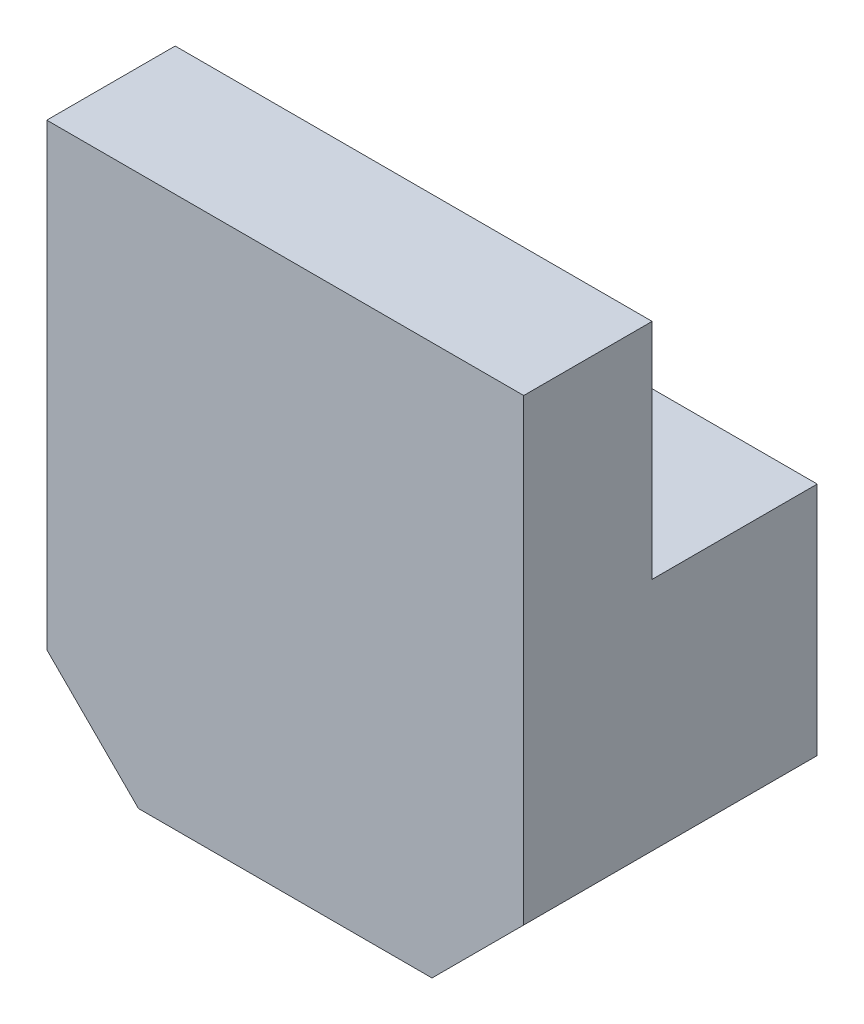
ISO-10303-21;
HEADER;
FILE_DESCRIPTION(('STEP AP214'),'2;1');
FILE_NAME('part.step','',(''),(''),'','','');
FILE_SCHEMA(('AUTOMOTIVE_DESIGN { 1 0 10303 214 1 1 1 1 }'));
ENDSEC;
DATA;
#1=APPLICATION_CONTEXT('core data for automotive mechanical design processes');
#2=APPLICATION_PROTOCOL_DEFINITION('international standard','automotive_design',2000,#1);
#3=PRODUCT_CONTEXT('',#1,'mechanical');
#4=PRODUCT('Part','Part','',(#3));
#5=PRODUCT_RELATED_PRODUCT_CATEGORY('part','',(#4));
#6=PRODUCT_DEFINITION_FORMATION('','',#4);
#7=PRODUCT_DEFINITION_CONTEXT('part definition',#1,'design');
#8=PRODUCT_DEFINITION('design','',#6,#7);
#9=PRODUCT_DEFINITION_SHAPE('','',#8);
#10=(LENGTH_UNIT() NAMED_UNIT(*) SI_UNIT(.MILLI.,.METRE.));
#11=(NAMED_UNIT(*) PLANE_ANGLE_UNIT() SI_UNIT($,.RADIAN.));
#12=(NAMED_UNIT(*) SI_UNIT($,.STERADIAN.) SOLID_ANGLE_UNIT());
#13=UNCERTAINTY_MEASURE_WITH_UNIT(LENGTH_MEASURE(1.E-05),#10,'distance_accuracy_value','');
#14=(GEOMETRIC_REPRESENTATION_CONTEXT(3) GLOBAL_UNCERTAINTY_ASSIGNED_CONTEXT((#13)) GLOBAL_UNIT_ASSIGNED_CONTEXT((#10,
#11,#12)) REPRESENTATION_CONTEXT('',''));
#15=CARTESIAN_POINT('',(0.,0.,0.));
#16=DIRECTION('',(0.,0.,1.));
#17=DIRECTION('',(1.,0.,0.));
#18=AXIS2_PLACEMENT_3D('',#15,#16,#17);
#19=CARTESIAN_POINT('',(1.143888154968,-1.580052129357,0.913683947277));
#20=DIRECTION('',(0.,0.,1.));
#21=DIRECTION('',(0.,-1.,0.));
#22=AXIS2_PLACEMENT_3D('',#19,#20,#21);
#23=PLANE('',#22);
#24=DIRECTION('',(-1.,0.,0.));
#25=VECTOR('',#24,1.);
#26=CARTESIAN_POINT('',(1.153495149314,-1.3,0.913683947277));
#27=LINE('',#26,#25);
#28=CARTESIAN_POINT('',(1.803495149314,-1.3,0.913683947277));
#29=VERTEX_POINT('',#28);
#30=CARTESIAN_POINT('',(0.503495149314,-1.3,0.913683947277));
#31=VERTEX_POINT('',#30);
#32=EDGE_CURVE('E135',#29,#31,#27,.T.);
#33=ORIENTED_EDGE('',*,*,#32,.F.);
#34=DIRECTION('',(0.,1.,0.));
#35=VECTOR('',#34,1.);
#36=CARTESIAN_POINT('',(1.803495149314,-1.3,0.913683947277));
#37=LINE('',#36,#35);
#38=CARTESIAN_POINT('',(1.803495149314,-1.908986830704,0.913683947277));
#39=VERTEX_POINT('',#38);
#40=EDGE_CURVE('E112',#39,#29,#37,.T.);
#41=ORIENTED_EDGE('',*,*,#40,.F.);
#42=DIRECTION('',(-1.,0.,0.));
#43=VECTOR('',#42,1.);
#44=CARTESIAN_POINT('',(1.143888154968,-1.908986830704,0.913683947277));
#45=LINE('',#44,#43);
#46=CARTESIAN_POINT('',(0.503495149314,-1.908986830704,0.913683947277));
#47=VERTEX_POINT('',#46);
#48=EDGE_CURVE('E11',#39,#47,#45,.T.);
#49=ORIENTED_EDGE('',*,*,#48,.T.);
#50=DIRECTION('',(0.,-1.,0.));
#51=VECTOR('',#50,1.);
#52=CARTESIAN_POINT('',(0.503495149314,-1.3,0.913683947277));
#53=LINE('',#52,#51);
#54=EDGE_CURVE('E180',#31,#47,#53,.T.);
#55=ORIENTED_EDGE('',*,*,#54,.F.);
#56=EDGE_LOOP('',(#33,#41,#49,#55));
#57=FACE_BOUND('',#56,.T.);
#58=ADVANCED_FACE('F17',(#57),#23,.F.);
#59=CARTESIAN_POINT('',(1.143888154968,-1.908986830704,0.463683947277));
#60=DIRECTION('',(0.,-1.,0.));
#61=DIRECTION('',(0.,0.,-1.));
#62=AXIS2_PLACEMENT_3D('',#59,#60,#61);
#63=PLANE('',#62);
#64=ORIENTED_EDGE('',*,*,#48,.F.);
#65=DIRECTION('',(0.,0.,1.));
#66=VECTOR('',#65,1.);
#67=CARTESIAN_POINT('',(1.803495149314,-1.908986830704,0.863683947277));
#68=LINE('',#67,#66);
#69=CARTESIAN_POINT('',(1.803495149314,-1.908986830704,0.463683947277));
#70=VERTEX_POINT('',#69);
#71=EDGE_CURVE('E134',#70,#39,#68,.T.);
#72=ORIENTED_EDGE('',*,*,#71,.F.);
#73=DIRECTION('',(1.,0.,0.));
#74=VECTOR('',#73,1.);
#75=CARTESIAN_POINT('',(1.153495149314,-1.908986830704,0.463683947277));
#76=LINE('',#75,#74);
#77=CARTESIAN_POINT('',(0.503495149314,-1.908986830704,0.463683947277));
#78=VERTEX_POINT('',#77);
#79=EDGE_CURVE('E28',#78,#70,#76,.T.);
#80=ORIENTED_EDGE('',*,*,#79,.F.);
#81=DIRECTION('',(0.,0.,-1.));
#82=VECTOR('',#81,1.);
#83=CARTESIAN_POINT('',(0.503495149314,-1.908986830704,0.863683947277));
#84=LINE('',#83,#82);
#85=EDGE_CURVE('E162',#47,#78,#84,.T.);
#86=ORIENTED_EDGE('',*,*,#85,.F.);
#87=EDGE_LOOP('',(#64,#72,#80,#86));
#88=FACE_BOUND('',#87,.T.);
#89=ADVANCED_FACE('F286',(#88),#63,.F.);
#90=CARTESIAN_POINT('',(1.153495149314,-1.3,0.463683947277));
#91=DIRECTION('',(0.,0.,-1.));
#92=DIRECTION('',(0.,-1.,0.));
#93=AXIS2_PLACEMENT_3D('',#90,#91,#92);
#94=PLANE('',#93);
#95=DIRECTION('',(0.707106781186548,-0.707106781186548,0.));
#96=VECTOR('',#95,1.);
#97=CARTESIAN_POINT('',(0.628495149314,-2.675,0.463683947277));
#98=LINE('',#97,#96);
#99=CARTESIAN_POINT('',(0.503495149314,-2.55,0.463683947277));
#100=VERTEX_POINT('',#99);
#101=CARTESIAN_POINT('',(0.753495149314,-2.8,0.463683947277));
#102=VERTEX_POINT('',#101);
#103=EDGE_CURVE('E42',#100,#102,#98,.T.);
#104=ORIENTED_EDGE('',*,*,#103,.F.);
#105=DIRECTION('',(0.,-1.,0.));
#106=VECTOR('',#105,1.);
#107=CARTESIAN_POINT('',(0.503495149314,-1.3,0.463683947277));
#108=LINE('',#107,#106);
#109=EDGE_CURVE('E158',#78,#100,#108,.T.);
#110=ORIENTED_EDGE('',*,*,#109,.F.);
#111=ORIENTED_EDGE('',*,*,#79,.T.);
#112=DIRECTION('',(0.,1.,0.));
#113=VECTOR('',#112,1.);
#114=CARTESIAN_POINT('',(1.803495149314,-1.3,0.463683947277));
#115=LINE('',#114,#113);
#116=CARTESIAN_POINT('',(1.803495149314,-2.55,0.463683947277));
#117=VERTEX_POINT('',#116);
#118=EDGE_CURVE('E125',#117,#70,#115,.T.);
#119=ORIENTED_EDGE('',*,*,#118,.F.);
#120=DIRECTION('',(0.707106781186548,0.707106781186548,0.));
#121=VECTOR('',#120,1.);
#122=CARTESIAN_POINT('',(1.678495149314,-2.675,0.463683947277));
#123=LINE('',#122,#121);
#124=CARTESIAN_POINT('',(1.553495149314,-2.8,0.463683947277));
#125=VERTEX_POINT('',#124);
#126=EDGE_CURVE('E118',#125,#117,#123,.T.);
#127=ORIENTED_EDGE('',*,*,#126,.F.);
#128=DIRECTION('',(-1.,0.,0.));
#129=VECTOR('',#128,1.);
#130=CARTESIAN_POINT('',(1.153495149314,-2.8,0.463683947277));
#131=LINE('',#130,#129);
#132=EDGE_CURVE('E121',#125,#102,#131,.T.);
#133=ORIENTED_EDGE('',*,*,#132,.T.);
#134=EDGE_LOOP('',(#104,#110,#111,#119,#127,#133));
#135=FACE_BOUND('',#134,.T.);
#136=ADVANCED_FACE('F131',(#135),#94,.T.);
#137=CARTESIAN_POINT('',(0.628495149314,-2.675,0.863683947277));
#138=DIRECTION('',(-0.707106781186548,-0.707106781186548,0.));
#139=DIRECTION('',(-0.707106781186548,0.707106781186548,0.));
#140=AXIS2_PLACEMENT_3D('',#137,#138,#139);
#141=PLANE('',#140);
#142=ORIENTED_EDGE('',*,*,#103,.T.);
#143=DIRECTION('',(0.,0.,1.));
#144=VECTOR('',#143,1.);
#145=CARTESIAN_POINT('',(0.753495149314,-2.8,0.863683947277));
#146=LINE('',#145,#144);
#147=CARTESIAN_POINT('',(0.753495149314,-2.8,1.263683947277));
#148=VERTEX_POINT('',#147);
#149=EDGE_CURVE('E157',#102,#148,#146,.T.);
#150=ORIENTED_EDGE('',*,*,#149,.T.);
#151=DIRECTION('',(0.707106781186548,-0.707106781186548,0.));
#152=VECTOR('',#151,1.);
#153=CARTESIAN_POINT('',(0.503495149314,-2.55,1.263683947277));
#154=LINE('',#153,#152);
#155=CARTESIAN_POINT('',(0.503495149314,-2.55,1.263683947277));
#156=VERTEX_POINT('',#155);
#157=EDGE_CURVE('E154',#156,#148,#154,.T.);
#158=ORIENTED_EDGE('',*,*,#157,.F.);
#159=DIRECTION('',(0.,0.,1.));
#160=VECTOR('',#159,1.);
#161=CARTESIAN_POINT('',(0.503495149314,-2.55,0.863683947277));
#162=LINE('',#161,#160);
#163=EDGE_CURVE('E161',#100,#156,#162,.T.);
#164=ORIENTED_EDGE('',*,*,#163,.F.);
#165=EDGE_LOOP('',(#142,#150,#158,#164));
#166=FACE_BOUND('',#165,.T.);
#167=ADVANCED_FACE('F270',(#166),#141,.T.);
#168=CARTESIAN_POINT('',(1.153495149314,-2.8,0.863683947277));
#169=DIRECTION('',(0.,1.,0.));
#170=DIRECTION('',(0.,0.,-1.));
#171=AXIS2_PLACEMENT_3D('',#168,#169,#170);
#172=PLANE('',#171);
#173=ORIENTED_EDGE('',*,*,#132,.F.);
#174=DIRECTION('',(0.,0.,-1.));
#175=VECTOR('',#174,1.);
#176=CARTESIAN_POINT('',(1.553495149314,-2.8,0.863683947277));
#177=LINE('',#176,#175);
#178=CARTESIAN_POINT('',(1.553495149314,-2.8,1.263683947277));
#179=VERTEX_POINT('',#178);
#180=EDGE_CURVE('E21',#179,#125,#177,.T.);
#181=ORIENTED_EDGE('',*,*,#180,.F.);
#182=DIRECTION('',(1.,0.,0.));
#183=VECTOR('',#182,1.);
#184=CARTESIAN_POINT('',(1.153495149314,-2.8,1.263683947277));
#185=LINE('',#184,#183);
#186=EDGE_CURVE('E167',#148,#179,#185,.T.);
#187=ORIENTED_EDGE('',*,*,#186,.F.);
#188=ORIENTED_EDGE('',*,*,#149,.F.);
#189=EDGE_LOOP('',(#173,#181,#187,#188));
#190=FACE_BOUND('',#189,.T.);
#191=ADVANCED_FACE('F263',(#190),#172,.F.);
#192=CARTESIAN_POINT('',(1.678495149314,-2.675,0.863683947277));
#193=DIRECTION('',(0.707106781186548,-0.707106781186548,0.));
#194=DIRECTION('',(0.,0.,-1.));
#195=AXIS2_PLACEMENT_3D('',#192,#193,#194);
#196=PLANE('',#195);
#197=DIRECTION('',(0.707106781186548,0.707106781186548,0.));
#198=VECTOR('',#197,1.);
#199=CARTESIAN_POINT('',(1.553495149314,-2.8,1.263683947277));
#200=LINE('',#199,#198);
#201=CARTESIAN_POINT('',(1.803495149314,-2.55,1.263683947277));
#202=VERTEX_POINT('',#201);
#203=EDGE_CURVE('E164',#179,#202,#200,.T.);
#204=ORIENTED_EDGE('',*,*,#203,.F.);
#205=ORIENTED_EDGE('',*,*,#180,.T.);
#206=ORIENTED_EDGE('',*,*,#126,.T.);
#207=DIRECTION('',(0.,0.,-1.));
#208=VECTOR('',#207,1.);
#209=CARTESIAN_POINT('',(1.803495149314,-2.55,0.863683947277));
#210=LINE('',#209,#208);
#211=EDGE_CURVE('E60',#202,#117,#210,.T.);
#212=ORIENTED_EDGE('',*,*,#211,.F.);
#213=EDGE_LOOP('',(#204,#205,#206,#212));
#214=FACE_BOUND('',#213,.T.);
#215=ADVANCED_FACE('F19',(#214),#196,.T.);
#216=CARTESIAN_POINT('',(1.803495149314,-1.3,0.863683947277));
#217=DIRECTION('',(1.,0.,0.));
#218=DIRECTION('',(0.,1.,0.));
#219=AXIS2_PLACEMENT_3D('',#216,#217,#218);
#220=PLANE('',#219);
#221=ORIENTED_EDGE('',*,*,#118,.T.);
#222=ORIENTED_EDGE('',*,*,#71,.T.);
#223=ORIENTED_EDGE('',*,*,#40,.T.);
#224=DIRECTION('',(0.,0.,-1.));
#225=VECTOR('',#224,1.);
#226=CARTESIAN_POINT('',(1.803495149314,-1.3,0.863683947277));
#227=LINE('',#226,#225);
#228=CARTESIAN_POINT('',(1.803495149314,-1.3,1.263683947277));
#229=VERTEX_POINT('',#228);
#230=EDGE_CURVE('E142',#229,#29,#227,.T.);
#231=ORIENTED_EDGE('',*,*,#230,.F.);
#232=DIRECTION('',(0.,1.,0.));
#233=VECTOR('',#232,1.);
#234=CARTESIAN_POINT('',(1.803495149314,-1.3,1.263683947277));
#235=LINE('',#234,#233);
#236=EDGE_CURVE('E127',#202,#229,#235,.T.);
#237=ORIENTED_EDGE('',*,*,#236,.F.);
#238=ORIENTED_EDGE('',*,*,#211,.T.);
#239=EDGE_LOOP('',(#221,#222,#223,#231,#237,#238));
#240=FACE_BOUND('',#239,.T.);
#241=ADVANCED_FACE('F124',(#240),#220,.T.);
#242=CARTESIAN_POINT('',(1.153495149314,-1.3,0.863683947277));
#243=DIRECTION('',(0.,1.,0.));
#244=DIRECTION('',(0.,0.,-1.));
#245=AXIS2_PLACEMENT_3D('',#242,#243,#244);
#246=PLANE('',#245);
#247=DIRECTION('',(-1.,0.,0.));
#248=VECTOR('',#247,1.);
#249=CARTESIAN_POINT('',(1.153495149314,-1.3,1.263683947277));
#250=LINE('',#249,#248);
#251=CARTESIAN_POINT('',(0.503495149314,-1.3,1.263683947277));
#252=VERTEX_POINT('',#251);
#253=EDGE_CURVE('E146',#229,#252,#250,.T.);
#254=ORIENTED_EDGE('',*,*,#253,.F.);
#255=ORIENTED_EDGE('',*,*,#230,.T.);
#256=ORIENTED_EDGE('',*,*,#32,.T.);
#257=DIRECTION('',(0.,0.,-1.));
#258=VECTOR('',#257,1.);
#259=CARTESIAN_POINT('',(0.503495149314,-1.3,0.863683947277));
#260=LINE('',#259,#258);
#261=EDGE_CURVE('E172',#252,#31,#260,.T.);
#262=ORIENTED_EDGE('',*,*,#261,.F.);
#263=EDGE_LOOP('',(#254,#255,#256,#262));
#264=FACE_BOUND('',#263,.T.);
#265=ADVANCED_FACE('F196',(#264),#246,.T.);
#266=CARTESIAN_POINT('',(0.503495149314,-1.3,0.863683947277));
#267=DIRECTION('',(-1.,0.,0.));
#268=DIRECTION('',(0.,0.,1.));
#269=AXIS2_PLACEMENT_3D('',#266,#267,#268);
#270=PLANE('',#269);
#271=DIRECTION('',(0.,-1.,0.));
#272=VECTOR('',#271,1.);
#273=CARTESIAN_POINT('',(0.503495149314,-1.3,1.263683947277));
#274=LINE('',#273,#272);
#275=EDGE_CURVE('E150',#252,#156,#274,.T.);
#276=ORIENTED_EDGE('',*,*,#275,.F.);
#277=ORIENTED_EDGE('',*,*,#261,.T.);
#278=ORIENTED_EDGE('',*,*,#54,.T.);
#279=ORIENTED_EDGE('',*,*,#85,.T.);
#280=ORIENTED_EDGE('',*,*,#109,.T.);
#281=ORIENTED_EDGE('',*,*,#163,.T.);
#282=EDGE_LOOP('',(#276,#277,#278,#279,#280,#281));
#283=FACE_BOUND('',#282,.T.);
#284=ADVANCED_FACE('F224',(#283),#270,.T.);
#285=CARTESIAN_POINT('',(1.153495149314,-1.3,1.263683947277));
#286=DIRECTION('',(0.,0.,1.));
#287=DIRECTION('',(1.,0.,0.));
#288=AXIS2_PLACEMENT_3D('',#285,#286,#287);
#289=PLANE('',#288);
#290=ORIENTED_EDGE('',*,*,#253,.T.);
#291=ORIENTED_EDGE('',*,*,#275,.T.);
#292=ORIENTED_EDGE('',*,*,#157,.T.);
#293=ORIENTED_EDGE('',*,*,#186,.T.);
#294=ORIENTED_EDGE('',*,*,#203,.T.);
#295=ORIENTED_EDGE('',*,*,#236,.T.);
#296=EDGE_LOOP('',(#290,#291,#292,#293,#294,#295));
#297=FACE_BOUND('',#296,.T.);
#298=ADVANCED_FACE('F199',(#297),#289,.T.);
#299=CLOSED_SHELL('',(#58,#89,#136,#167,#191,#215,#241,#265,#284,#298));
#300=MANIFOLD_SOLID_BREP('B1',#299);
#301=ADVANCED_BREP_SHAPE_REPRESENTATION('',(#18,#300),#14);
#302=SHAPE_DEFINITION_REPRESENTATION(#9,#301);
ENDSEC;
END-ISO-10303-21;
